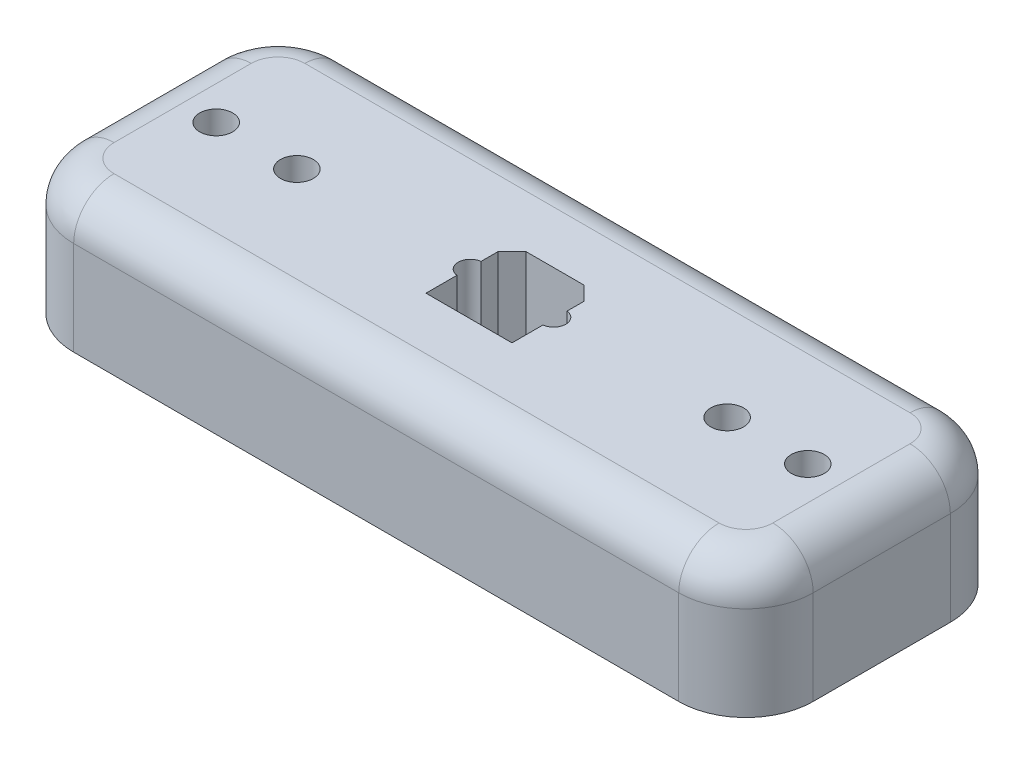
ISO-10303-21;
HEADER;
FILE_DESCRIPTION(('STEP AP214'),'2;1');
FILE_NAME('part.step','',(''),(''),'','','');
FILE_SCHEMA(('AUTOMOTIVE_DESIGN { 1 0 10303 214 1 1 1 1 }'));
ENDSEC;
DATA;
#1=APPLICATION_CONTEXT('core data for automotive mechanical design processes');
#2=APPLICATION_PROTOCOL_DEFINITION('international standard','automotive_design',2000,#1);
#3=PRODUCT_CONTEXT('',#1,'mechanical');
#4=PRODUCT('Part','Part','',(#3));
#5=PRODUCT_RELATED_PRODUCT_CATEGORY('part','',(#4));
#6=PRODUCT_DEFINITION_FORMATION('','',#4);
#7=PRODUCT_DEFINITION_CONTEXT('part definition',#1,'design');
#8=PRODUCT_DEFINITION('design','',#6,#7);
#9=PRODUCT_DEFINITION_SHAPE('','',#8);
#10=(LENGTH_UNIT() NAMED_UNIT(*) SI_UNIT(.MILLI.,.METRE.));
#11=(NAMED_UNIT(*) PLANE_ANGLE_UNIT() SI_UNIT($,.RADIAN.));
#12=(NAMED_UNIT(*) SI_UNIT($,.STERADIAN.) SOLID_ANGLE_UNIT());
#13=UNCERTAINTY_MEASURE_WITH_UNIT(LENGTH_MEASURE(1.E-05),#10,'distance_accuracy_value','');
#14=(GEOMETRIC_REPRESENTATION_CONTEXT(3) GLOBAL_UNCERTAINTY_ASSIGNED_CONTEXT((#13)) GLOBAL_UNIT_ASSIGNED_CONTEXT((#10,
#11,#12)) REPRESENTATION_CONTEXT('',''));
#15=CARTESIAN_POINT('',(0.,0.,0.));
#16=DIRECTION('',(0.,0.,1.));
#17=DIRECTION('',(1.,0.,0.));
#18=AXIS2_PLACEMENT_3D('',#15,#16,#17);
#19=CARTESIAN_POINT('',(0.,10.,-10.1));
#20=DIRECTION('',(0.,0.,1.));
#21=DIRECTION('',(1.,0.,0.));
#22=AXIS2_PLACEMENT_3D('',#19,#20,#21);
#23=PLANE('',#22);
#24=DIRECTION('',(0.,-1.,0.));
#25=VECTOR('',#24,1.);
#26=CARTESIAN_POINT('',(-22.5,10.,-10.1));
#27=LINE('',#26,#25);
#28=CARTESIAN_POINT('',(-22.5,7.,-10.1));
#29=VERTEX_POINT('',#28);
#30=CARTESIAN_POINT('',(-22.5,0.,-10.1));
#31=VERTEX_POINT('',#30);
#32=EDGE_CURVE('E226',#29,#31,#27,.T.);
#33=ORIENTED_EDGE('',*,*,#32,.F.);
#34=DIRECTION('',(-1.,0.,0.));
#35=VECTOR('',#34,1.);
#36=CARTESIAN_POINT('',(22.5,7.,-10.1));
#37=LINE('',#36,#35);
#38=CARTESIAN_POINT('',(22.5,7.,-10.1));
#39=VERTEX_POINT('',#38);
#40=EDGE_CURVE('E47',#29,#39,#37,.F.);
#41=ORIENTED_EDGE('',*,*,#40,.T.);
#42=DIRECTION('',(0.,-1.,0.));
#43=VECTOR('',#42,1.);
#44=CARTESIAN_POINT('',(22.5,10.,-10.1));
#45=LINE('',#44,#43);
#46=CARTESIAN_POINT('',(22.5,0.,-10.1));
#47=VERTEX_POINT('',#46);
#48=EDGE_CURVE('E214',#39,#47,#45,.T.);
#49=ORIENTED_EDGE('',*,*,#48,.T.);
#50=DIRECTION('',(-1.,0.,0.));
#51=VECTOR('',#50,1.);
#52=CARTESIAN_POINT('',(0.,0.,-10.1));
#53=LINE('',#52,#51);
#54=EDGE_CURVE('E338',#47,#31,#53,.T.);
#55=ORIENTED_EDGE('',*,*,#54,.T.);
#56=EDGE_LOOP('',(#33,#41,#49,#55));
#57=FACE_BOUND('',#56,.T.);
#58=ADVANCED_FACE('F38',(#57),#23,.F.);
#59=CARTESIAN_POINT('',(-22.5,10.,-5.09999999999998));
#60=DIRECTION('',(0.,-1.,0.));
#61=DIRECTION('',(0.,0.,-1.));
#62=AXIS2_PLACEMENT_3D('',#59,#60,#61);
#63=CYLINDRICAL_SURFACE('',#62,5.);
#64=DIRECTION('',(0.,-1.,0.));
#65=VECTOR('',#64,1.);
#66=CARTESIAN_POINT('',(-27.5,10.,-5.09999999999994));
#67=LINE('',#66,#65);
#68=CARTESIAN_POINT('',(-27.5,7.,-5.09999999999994));
#69=VERTEX_POINT('',#68);
#70=CARTESIAN_POINT('',(-27.5,0.,-5.09999999999994));
#71=VERTEX_POINT('',#70);
#72=EDGE_CURVE('E370',#69,#71,#67,.T.);
#73=ORIENTED_EDGE('',*,*,#72,.F.);
#74=CARTESIAN_POINT('',(-22.5,7.,-5.09999999999998));
#75=DIRECTION('',(0.,1.,0.));
#76=DIRECTION('',(0.,0.,1.));
#77=AXIS2_PLACEMENT_3D('',#74,#75,#76);
#78=CIRCLE('',#77,5.);
#79=EDGE_CURVE('E244',#69,#29,#78,.F.);
#80=ORIENTED_EDGE('',*,*,#79,.T.);
#81=ORIENTED_EDGE('',*,*,#32,.T.);
#82=CARTESIAN_POINT('',(-22.5,0.,-5.09999999999998));
#83=DIRECTION('',(0.,1.,0.));
#84=DIRECTION('',(0.,0.,1.));
#85=AXIS2_PLACEMENT_3D('',#82,#83,#84);
#86=CIRCLE('',#85,5.);
#87=EDGE_CURVE('E341',#31,#71,#86,.T.);
#88=ORIENTED_EDGE('',*,*,#87,.T.);
#89=EDGE_LOOP('',(#73,#80,#81,#88));
#90=FACE_BOUND('',#89,.T.);
#91=ADVANCED_FACE('F446',(#90),#63,.T.);
#92=CARTESIAN_POINT('',(-27.5,10.,0.));
#93=DIRECTION('',(1.,0.,0.));
#94=DIRECTION('',(0.,0.,-1.));
#95=AXIS2_PLACEMENT_3D('',#92,#93,#94);
#96=PLANE('',#95);
#97=DIRECTION('',(0.,-1.,0.));
#98=VECTOR('',#97,1.);
#99=CARTESIAN_POINT('',(-27.5,10.,5.09999999999998));
#100=LINE('',#99,#98);
#101=CARTESIAN_POINT('',(-27.5,7.,5.09999999999998));
#102=VERTEX_POINT('',#101);
#103=CARTESIAN_POINT('',(-27.5,0.,5.09999999999998));
#104=VERTEX_POINT('',#103);
#105=EDGE_CURVE('E368',#102,#104,#100,.T.);
#106=ORIENTED_EDGE('',*,*,#105,.F.);
#107=DIRECTION('',(0.,0.,1.));
#108=VECTOR('',#107,1.);
#109=CARTESIAN_POINT('',(-27.5,7.,-5.09999999999994));
#110=LINE('',#109,#108);
#111=EDGE_CURVE('E249',#102,#69,#110,.F.);
#112=ORIENTED_EDGE('',*,*,#111,.T.);
#113=ORIENTED_EDGE('',*,*,#72,.T.);
#114=DIRECTION('',(0.,0.,1.));
#115=VECTOR('',#114,1.);
#116=CARTESIAN_POINT('',(-27.5,0.,0.));
#117=LINE('',#116,#115);
#118=EDGE_CURVE('E344',#71,#104,#117,.T.);
#119=ORIENTED_EDGE('',*,*,#118,.T.);
#120=EDGE_LOOP('',(#106,#112,#113,#119));
#121=FACE_BOUND('',#120,.T.);
#122=ADVANCED_FACE('F452',(#121),#96,.F.);
#123=CARTESIAN_POINT('',(-22.5,10.,5.10000000000002));
#124=DIRECTION('',(0.,-1.,0.));
#125=DIRECTION('',(0.,0.,-1.));
#126=AXIS2_PLACEMENT_3D('',#123,#124,#125);
#127=CYLINDRICAL_SURFACE('',#126,5.);
#128=DIRECTION('',(0.,-1.,0.));
#129=VECTOR('',#128,1.);
#130=CARTESIAN_POINT('',(-22.5,10.,10.1));
#131=LINE('',#130,#129);
#132=CARTESIAN_POINT('',(-22.5,7.,10.1));
#133=VERTEX_POINT('',#132);
#134=CARTESIAN_POINT('',(-22.5,0.,10.1));
#135=VERTEX_POINT('',#134);
#136=EDGE_CURVE('E366',#133,#135,#131,.T.);
#137=ORIENTED_EDGE('',*,*,#136,.F.);
#138=CARTESIAN_POINT('',(-22.5,7.,5.10000000000002));
#139=DIRECTION('',(0.,1.,0.));
#140=DIRECTION('',(0.,0.,1.));
#141=AXIS2_PLACEMENT_3D('',#138,#139,#140);
#142=CIRCLE('',#141,5.);
#143=EDGE_CURVE('E241',#133,#102,#142,.F.);
#144=ORIENTED_EDGE('',*,*,#143,.T.);
#145=ORIENTED_EDGE('',*,*,#105,.T.);
#146=CARTESIAN_POINT('',(-22.5,0.,5.10000000000002));
#147=DIRECTION('',(0.,1.,0.));
#148=DIRECTION('',(0.,0.,1.));
#149=AXIS2_PLACEMENT_3D('',#146,#147,#148);
#150=CIRCLE('',#149,5.);
#151=EDGE_CURVE('E347',#104,#135,#150,.T.);
#152=ORIENTED_EDGE('',*,*,#151,.T.);
#153=EDGE_LOOP('',(#137,#144,#145,#152));
#154=FACE_BOUND('',#153,.T.);
#155=ADVANCED_FACE('F716',(#154),#127,.T.);
#156=CARTESIAN_POINT('',(0.,10.,10.1));
#157=DIRECTION('',(0.,0.,-1.));
#158=DIRECTION('',(-1.,0.,0.));
#159=AXIS2_PLACEMENT_3D('',#156,#157,#158);
#160=PLANE('',#159);
#161=DIRECTION('',(0.,-1.,0.));
#162=VECTOR('',#161,1.);
#163=CARTESIAN_POINT('',(22.5,10.,10.1));
#164=LINE('',#163,#162);
#165=CARTESIAN_POINT('',(22.5,7.,10.1));
#166=VERTEX_POINT('',#165);
#167=CARTESIAN_POINT('',(22.5,0.,10.1));
#168=VERTEX_POINT('',#167);
#169=EDGE_CURVE('E364',#166,#168,#164,.T.);
#170=ORIENTED_EDGE('',*,*,#169,.F.);
#171=DIRECTION('',(1.,0.,0.));
#172=VECTOR('',#171,1.);
#173=CARTESIAN_POINT('',(-22.5,7.,10.1));
#174=LINE('',#173,#172);
#175=EDGE_CURVE('E11',#166,#133,#174,.F.);
#176=ORIENTED_EDGE('',*,*,#175,.T.);
#177=ORIENTED_EDGE('',*,*,#136,.T.);
#178=DIRECTION('',(1.,0.,0.));
#179=VECTOR('',#178,1.);
#180=CARTESIAN_POINT('',(0.,0.,10.1));
#181=LINE('',#180,#179);
#182=EDGE_CURVE('E350',#135,#168,#181,.T.);
#183=ORIENTED_EDGE('',*,*,#182,.T.);
#184=EDGE_LOOP('',(#170,#176,#177,#183));
#185=FACE_BOUND('',#184,.T.);
#186=ADVANCED_FACE('F708',(#185),#160,.F.);
#187=CARTESIAN_POINT('',(22.5,10.,5.10000000000001));
#188=DIRECTION('',(0.,-1.,0.));
#189=DIRECTION('',(0.,0.,-1.));
#190=AXIS2_PLACEMENT_3D('',#187,#188,#189);
#191=CYLINDRICAL_SURFACE('',#190,5.);
#192=DIRECTION('',(0.,-1.,0.));
#193=VECTOR('',#192,1.);
#194=CARTESIAN_POINT('',(27.5,10.,5.09999999999998));
#195=LINE('',#194,#193);
#196=CARTESIAN_POINT('',(27.5,7.,5.09999999999998));
#197=VERTEX_POINT('',#196);
#198=CARTESIAN_POINT('',(27.5,0.,5.09999999999998));
#199=VERTEX_POINT('',#198);
#200=EDGE_CURVE('E362',#197,#199,#195,.T.);
#201=ORIENTED_EDGE('',*,*,#200,.F.);
#202=CARTESIAN_POINT('',(22.5,7.,5.10000000000001));
#203=DIRECTION('',(0.,1.,0.));
#204=DIRECTION('',(0.,0.,1.));
#205=AXIS2_PLACEMENT_3D('',#202,#203,#204);
#206=CIRCLE('',#205,5.);
#207=EDGE_CURVE('E55',#197,#166,#206,.F.);
#208=ORIENTED_EDGE('',*,*,#207,.T.);
#209=ORIENTED_EDGE('',*,*,#169,.T.);
#210=CARTESIAN_POINT('',(22.5,0.,5.10000000000001));
#211=DIRECTION('',(0.,1.,0.));
#212=DIRECTION('',(0.,0.,1.));
#213=AXIS2_PLACEMENT_3D('',#210,#211,#212);
#214=CIRCLE('',#213,5.);
#215=EDGE_CURVE('E353',#199,#168,#214,.F.);
#216=ORIENTED_EDGE('',*,*,#215,.F.);
#217=EDGE_LOOP('',(#201,#208,#209,#216));
#218=FACE_BOUND('',#217,.T.);
#219=ADVANCED_FACE('F700',(#218),#191,.T.);
#220=CARTESIAN_POINT('',(27.5,10.,0.));
#221=DIRECTION('',(-1.,0.,0.));
#222=DIRECTION('',(0.,0.,1.));
#223=AXIS2_PLACEMENT_3D('',#220,#221,#222);
#224=PLANE('',#223);
#225=DIRECTION('',(0.,-1.,0.));
#226=VECTOR('',#225,1.);
#227=CARTESIAN_POINT('',(27.5,10.,-5.09999999999995));
#228=LINE('',#227,#226);
#229=CARTESIAN_POINT('',(27.5,7.,-5.09999999999995));
#230=VERTEX_POINT('',#229);
#231=CARTESIAN_POINT('',(27.5,0.,-5.09999999999995));
#232=VERTEX_POINT('',#231);
#233=EDGE_CURVE('E217',#230,#232,#228,.T.);
#234=ORIENTED_EDGE('',*,*,#233,.F.);
#235=DIRECTION('',(0.,0.,-1.));
#236=VECTOR('',#235,1.);
#237=CARTESIAN_POINT('',(27.5,7.,5.09999999999998));
#238=LINE('',#237,#236);
#239=EDGE_CURVE('E63',#230,#197,#238,.F.);
#240=ORIENTED_EDGE('',*,*,#239,.T.);
#241=ORIENTED_EDGE('',*,*,#200,.T.);
#242=DIRECTION('',(0.,0.,-1.));
#243=VECTOR('',#242,1.);
#244=CARTESIAN_POINT('',(27.5,0.,0.));
#245=LINE('',#244,#243);
#246=EDGE_CURVE('E356',#199,#232,#245,.T.);
#247=ORIENTED_EDGE('',*,*,#246,.T.);
#248=EDGE_LOOP('',(#234,#240,#241,#247));
#249=FACE_BOUND('',#248,.T.);
#250=ADVANCED_FACE('F693',(#249),#224,.F.);
#251=CARTESIAN_POINT('',(-3.1,10.,0.));
#252=DIRECTION('',(0.,-1.,0.));
#253=DIRECTION('',(0.,0.,-1.));
#254=AXIS2_PLACEMENT_3D('',#251,#252,#253);
#255=CYLINDRICAL_SURFACE('',#254,0.9);
#256=CARTESIAN_POINT('',(-3.1,2.5,0.));
#257=DIRECTION('',(0.,1.,0.));
#258=DIRECTION('',(0.,0.,1.));
#259=AXIS2_PLACEMENT_3D('',#256,#257,#258);
#260=CIRCLE('',#259,0.9);
#261=CARTESIAN_POINT('',(-3.2,2.5,-0.894427190999916));
#262=VERTEX_POINT('',#261);
#263=CARTESIAN_POINT('',(-3.2,2.5,0.894427190999916));
#264=VERTEX_POINT('',#263);
#265=EDGE_CURVE('E191',#262,#264,#260,.T.);
#266=ORIENTED_EDGE('',*,*,#265,.F.);
#267=DIRECTION('',(0.,-1.,0.));
#268=VECTOR('',#267,1.);
#269=CARTESIAN_POINT('',(-3.2,10.,-0.894427190999916));
#270=LINE('',#269,#268);
#271=CARTESIAN_POINT('',(-3.2,10.,-0.894427190999916));
#272=VERTEX_POINT('',#271);
#273=EDGE_CURVE('E205',#272,#262,#270,.T.);
#274=ORIENTED_EDGE('',*,*,#273,.F.);
#275=CARTESIAN_POINT('',(-3.1,10.,0.));
#276=DIRECTION('',(0.,1.,0.));
#277=DIRECTION('',(0.,0.,1.));
#278=AXIS2_PLACEMENT_3D('',#275,#276,#277);
#279=CIRCLE('',#278,0.9);
#280=CARTESIAN_POINT('',(-3.2,10.,0.894427190999916));
#281=VERTEX_POINT('',#280);
#282=EDGE_CURVE('E301',#272,#281,#279,.T.);
#283=ORIENTED_EDGE('',*,*,#282,.T.);
#284=DIRECTION('',(0.,-1.,0.));
#285=VECTOR('',#284,1.);
#286=CARTESIAN_POINT('',(-3.2,10.,0.894427190999916));
#287=LINE('',#286,#285);
#288=EDGE_CURVE('E208',#281,#264,#287,.T.);
#289=ORIENTED_EDGE('',*,*,#288,.T.);
#290=EDGE_LOOP('',(#266,#274,#283,#289));
#291=FACE_BOUND('',#290,.T.);
#292=ADVANCED_FACE('F203',(#291),#255,.F.);
#293=CARTESIAN_POINT('',(-3.2,10.,0.));
#294=DIRECTION('',(-1.,0.,0.));
#295=DIRECTION('',(0.,0.,1.));
#296=AXIS2_PLACEMENT_3D('',#293,#294,#295);
#297=PLANE('',#296);
#298=ORIENTED_EDGE('',*,*,#273,.T.);
#299=DIRECTION('',(0.,0.,-1.));
#300=VECTOR('',#299,1.);
#301=CARTESIAN_POINT('',(-3.2,2.5,0.));
#302=LINE('',#301,#300);
#303=CARTESIAN_POINT('',(-3.2,2.5,-2.14142135623731));
#304=VERTEX_POINT('',#303);
#305=EDGE_CURVE('E188',#262,#304,#302,.T.);
#306=ORIENTED_EDGE('',*,*,#305,.T.);
#307=DIRECTION('',(0.,-1.,0.));
#308=VECTOR('',#307,1.);
#309=CARTESIAN_POINT('',(-3.2,10.,-2.14142135623731));
#310=LINE('',#309,#308);
#311=CARTESIAN_POINT('',(-3.2,10.,-2.14142135623731));
#312=VERTEX_POINT('',#311);
#313=EDGE_CURVE('E215',#312,#304,#310,.T.);
#314=ORIENTED_EDGE('',*,*,#313,.F.);
#315=DIRECTION('',(0.,0.,-1.));
#316=VECTOR('',#315,1.);
#317=CARTESIAN_POINT('',(-3.2,10.,0.));
#318=LINE('',#317,#316);
#319=EDGE_CURVE('E212',#272,#312,#318,.T.);
#320=ORIENTED_EDGE('',*,*,#319,.F.);
#321=EDGE_LOOP('',(#298,#306,#314,#320));
#322=FACE_BOUND('',#321,.T.);
#323=ADVANCED_FACE('F211',(#322),#297,.F.);
#324=CARTESIAN_POINT('',(-2.67071067811865,10.,-2.67071067811865));
#325=DIRECTION('',(0.707106781186548,0.,0.707106781186548));
#326=DIRECTION('',(0.707106781186548,0.,-0.707106781186548));
#327=AXIS2_PLACEMENT_3D('',#324,#325,#326);
#328=PLANE('',#327);
#329=DIRECTION('',(-0.707106781186548,0.,0.707106781186548));
#330=VECTOR('',#329,1.);
#331=CARTESIAN_POINT('',(-2.67071067811865,2.5,-2.67071067811865));
#332=LINE('',#331,#330);
#333=CARTESIAN_POINT('',(-2.14142135623731,2.5,-3.2));
#334=VERTEX_POINT('',#333);
#335=EDGE_CURVE('E194',#334,#304,#332,.T.);
#336=ORIENTED_EDGE('',*,*,#335,.F.);
#337=DIRECTION('',(0.,-1.,0.));
#338=VECTOR('',#337,1.);
#339=CARTESIAN_POINT('',(-2.14142135623731,10.,-3.2));
#340=LINE('',#339,#338);
#341=CARTESIAN_POINT('',(-2.14142135623731,10.,-3.2));
#342=VERTEX_POINT('',#341);
#343=EDGE_CURVE('E219',#342,#334,#340,.T.);
#344=ORIENTED_EDGE('',*,*,#343,.F.);
#345=DIRECTION('',(-0.707106781186548,0.,0.707106781186548));
#346=VECTOR('',#345,1.);
#347=CARTESIAN_POINT('',(-2.67071067811865,10.,-2.67071067811865));
#348=LINE('',#347,#346);
#349=EDGE_CURVE('E304',#342,#312,#348,.T.);
#350=ORIENTED_EDGE('',*,*,#349,.T.);
#351=ORIENTED_EDGE('',*,*,#313,.T.);
#352=EDGE_LOOP('',(#336,#344,#350,#351));
#353=FACE_BOUND('',#352,.T.);
#354=ADVANCED_FACE('F400',(#353),#328,.T.);
#355=CARTESIAN_POINT('',(0.,10.,-3.2));
#356=DIRECTION('',(0.,0.,-1.));
#357=DIRECTION('',(-1.,0.,0.));
#358=AXIS2_PLACEMENT_3D('',#355,#356,#357);
#359=PLANE('',#358);
#360=ORIENTED_EDGE('',*,*,#343,.T.);
#361=DIRECTION('',(1.,0.,0.));
#362=VECTOR('',#361,1.);
#363=CARTESIAN_POINT('',(0.,2.5,-3.2));
#364=LINE('',#363,#362);
#365=CARTESIAN_POINT('',(2.14142135623732,2.5,-3.2));
#366=VERTEX_POINT('',#365);
#367=EDGE_CURVE('E397',#334,#366,#364,.T.);
#368=ORIENTED_EDGE('',*,*,#367,.T.);
#369=DIRECTION('',(0.,-1.,0.));
#370=VECTOR('',#369,1.);
#371=CARTESIAN_POINT('',(2.14142135623732,10.,-3.2));
#372=LINE('',#371,#370);
#373=CARTESIAN_POINT('',(2.14142135623732,10.,-3.2));
#374=VERTEX_POINT('',#373);
#375=EDGE_CURVE('E389',#374,#366,#372,.T.);
#376=ORIENTED_EDGE('',*,*,#375,.F.);
#377=DIRECTION('',(1.,0.,0.));
#378=VECTOR('',#377,1.);
#379=CARTESIAN_POINT('',(0.,10.,-3.2));
#380=LINE('',#379,#378);
#381=EDGE_CURVE('E307',#342,#374,#380,.T.);
#382=ORIENTED_EDGE('',*,*,#381,.F.);
#383=EDGE_LOOP('',(#360,#368,#376,#382));
#384=FACE_BOUND('',#383,.T.);
#385=ADVANCED_FACE('F395',(#384),#359,.F.);
#386=CARTESIAN_POINT('',(2.67071067811866,10.,-2.67071067811866));
#387=DIRECTION('',(0.707106781186548,0.,-0.707106781186548));
#388=DIRECTION('',(-0.707106781186548,0.,-0.707106781186548));
#389=AXIS2_PLACEMENT_3D('',#386,#387,#388);
#390=PLANE('',#389);
#391=ORIENTED_EDGE('',*,*,#375,.T.);
#392=DIRECTION('',(0.707106781186548,0.,0.707106781186548));
#393=VECTOR('',#392,1.);
#394=CARTESIAN_POINT('',(2.67071067811866,2.5,-2.67071067811866));
#395=LINE('',#394,#393);
#396=CARTESIAN_POINT('',(3.2,2.5,-2.14142135623731));
#397=VERTEX_POINT('',#396);
#398=EDGE_CURVE('E401',#366,#397,#395,.T.);
#399=ORIENTED_EDGE('',*,*,#398,.T.);
#400=DIRECTION('',(0.,-1.,0.));
#401=VECTOR('',#400,1.);
#402=CARTESIAN_POINT('',(3.2,10.,-2.14142135623731));
#403=LINE('',#402,#401);
#404=CARTESIAN_POINT('',(3.2,10.,-2.14142135623731));
#405=VERTEX_POINT('',#404);
#406=EDGE_CURVE('E386',#405,#397,#403,.T.);
#407=ORIENTED_EDGE('',*,*,#406,.F.);
#408=DIRECTION('',(0.707106781186548,0.,0.707106781186548));
#409=VECTOR('',#408,1.);
#410=CARTESIAN_POINT('',(2.67071067811866,10.,-2.67071067811866));
#411=LINE('',#410,#409);
#412=EDGE_CURVE('E310',#374,#405,#411,.T.);
#413=ORIENTED_EDGE('',*,*,#412,.F.);
#414=EDGE_LOOP('',(#391,#399,#407,#413));
#415=FACE_BOUND('',#414,.T.);
#416=ADVANCED_FACE('F436',(#415),#390,.F.);
#417=CARTESIAN_POINT('',(3.2,10.,0.));
#418=DIRECTION('',(-1.,0.,0.));
#419=DIRECTION('',(0.,0.,1.));
#420=AXIS2_PLACEMENT_3D('',#417,#418,#419);
#421=PLANE('',#420);
#422=DIRECTION('',(0.,0.,-1.));
#423=VECTOR('',#422,1.);
#424=CARTESIAN_POINT('',(3.2,2.5,0.));
#425=LINE('',#424,#423);
#426=CARTESIAN_POINT('',(3.2,2.5,-0.894427190999917));
#427=VERTEX_POINT('',#426);
#428=EDGE_CURVE('E403',#427,#397,#425,.T.);
#429=ORIENTED_EDGE('',*,*,#428,.F.);
#430=DIRECTION('',(0.,-1.,0.));
#431=VECTOR('',#430,1.);
#432=CARTESIAN_POINT('',(3.2,10.,-0.894427190999917));
#433=LINE('',#432,#431);
#434=CARTESIAN_POINT('',(3.2,10.,-0.894427190999917));
#435=VERTEX_POINT('',#434);
#436=EDGE_CURVE('E383',#435,#427,#433,.T.);
#437=ORIENTED_EDGE('',*,*,#436,.F.);
#438=DIRECTION('',(0.,0.,-1.));
#439=VECTOR('',#438,1.);
#440=CARTESIAN_POINT('',(3.2,10.,0.));
#441=LINE('',#440,#439);
#442=EDGE_CURVE('E312',#435,#405,#441,.T.);
#443=ORIENTED_EDGE('',*,*,#442,.T.);
#444=ORIENTED_EDGE('',*,*,#406,.T.);
#445=EDGE_LOOP('',(#429,#437,#443,#444));
#446=FACE_BOUND('',#445,.T.);
#447=ADVANCED_FACE('F433',(#446),#421,.T.);
#448=CARTESIAN_POINT('',(3.1,10.,0.));
#449=DIRECTION('',(0.,-1.,0.));
#450=DIRECTION('',(0.,0.,-1.));
#451=AXIS2_PLACEMENT_3D('',#448,#449,#450);
#452=CYLINDRICAL_SURFACE('',#451,0.9);
#453=CARTESIAN_POINT('',(3.1,2.5,0.));
#454=DIRECTION('',(0.,1.,0.));
#455=DIRECTION('',(0.,0.,1.));
#456=AXIS2_PLACEMENT_3D('',#453,#454,#455);
#457=CIRCLE('',#456,0.9);
#458=CARTESIAN_POINT('',(3.2,2.5,0.894427190999915));
#459=VERTEX_POINT('',#458);
#460=EDGE_CURVE('E407',#459,#427,#457,.T.);
#461=ORIENTED_EDGE('',*,*,#460,.F.);
#462=DIRECTION('',(0.,-1.,0.));
#463=VECTOR('',#462,1.);
#464=CARTESIAN_POINT('',(3.2,10.,0.894427190999915));
#465=LINE('',#464,#463);
#466=CARTESIAN_POINT('',(3.2,10.,0.894427190999915));
#467=VERTEX_POINT('',#466);
#468=EDGE_CURVE('E380',#467,#459,#465,.T.);
#469=ORIENTED_EDGE('',*,*,#468,.F.);
#470=CARTESIAN_POINT('',(3.1,10.,0.));
#471=DIRECTION('',(0.,1.,0.));
#472=DIRECTION('',(0.,0.,1.));
#473=AXIS2_PLACEMENT_3D('',#470,#471,#472);
#474=CIRCLE('',#473,0.9);
#475=EDGE_CURVE('E315',#467,#435,#474,.T.);
#476=ORIENTED_EDGE('',*,*,#475,.T.);
#477=ORIENTED_EDGE('',*,*,#436,.T.);
#478=EDGE_LOOP('',(#461,#469,#476,#477));
#479=FACE_BOUND('',#478,.T.);
#480=ADVANCED_FACE('F430',(#479),#452,.F.);
#481=CARTESIAN_POINT('',(3.2,10.,0.));
#482=DIRECTION('',(-1.,0.,0.));
#483=DIRECTION('',(0.,0.,1.));
#484=AXIS2_PLACEMENT_3D('',#481,#482,#483);
#485=PLANE('',#484);
#486=DIRECTION('',(0.,0.,-1.));
#487=VECTOR('',#486,1.);
#488=CARTESIAN_POINT('',(3.2,2.5,0.));
#489=LINE('',#488,#487);
#490=CARTESIAN_POINT('',(3.2,2.5,3.2));
#491=VERTEX_POINT('',#490);
#492=EDGE_CURVE('E409',#491,#459,#489,.T.);
#493=ORIENTED_EDGE('',*,*,#492,.F.);
#494=DIRECTION('',(0.,-1.,0.));
#495=VECTOR('',#494,1.);
#496=CARTESIAN_POINT('',(3.2,10.,3.2));
#497=LINE('',#496,#495);
#498=CARTESIAN_POINT('',(3.2,10.,3.2));
#499=VERTEX_POINT('',#498);
#500=EDGE_CURVE('E377',#499,#491,#497,.T.);
#501=ORIENTED_EDGE('',*,*,#500,.F.);
#502=DIRECTION('',(0.,0.,-1.));
#503=VECTOR('',#502,1.);
#504=CARTESIAN_POINT('',(3.2,10.,0.));
#505=LINE('',#504,#503);
#506=EDGE_CURVE('E318',#499,#467,#505,.T.);
#507=ORIENTED_EDGE('',*,*,#506,.T.);
#508=ORIENTED_EDGE('',*,*,#468,.T.);
#509=EDGE_LOOP('',(#493,#501,#507,#508));
#510=FACE_BOUND('',#509,.T.);
#511=ADVANCED_FACE('F423',(#510),#485,.T.);
#512=CARTESIAN_POINT('',(0.,10.,3.2));
#513=DIRECTION('',(0.,0.,-1.));
#514=DIRECTION('',(-1.,0.,0.));
#515=AXIS2_PLACEMENT_3D('',#512,#513,#514);
#516=PLANE('',#515);
#517=DIRECTION('',(1.,0.,0.));
#518=VECTOR('',#517,1.);
#519=CARTESIAN_POINT('',(0.,2.5,3.2));
#520=LINE('',#519,#518);
#521=CARTESIAN_POINT('',(-3.2,2.5,3.2));
#522=VERTEX_POINT('',#521);
#523=EDGE_CURVE('E411',#522,#491,#520,.T.);
#524=ORIENTED_EDGE('',*,*,#523,.F.);
#525=DIRECTION('',(0.,-1.,0.));
#526=VECTOR('',#525,1.);
#527=CARTESIAN_POINT('',(-3.2,10.,3.2));
#528=LINE('',#527,#526);
#529=CARTESIAN_POINT('',(-3.2,10.,3.2));
#530=VERTEX_POINT('',#529);
#531=EDGE_CURVE('E374',#530,#522,#528,.T.);
#532=ORIENTED_EDGE('',*,*,#531,.F.);
#533=DIRECTION('',(1.,0.,0.));
#534=VECTOR('',#533,1.);
#535=CARTESIAN_POINT('',(0.,10.,3.2));
#536=LINE('',#535,#534);
#537=EDGE_CURVE('E321',#530,#499,#536,.T.);
#538=ORIENTED_EDGE('',*,*,#537,.T.);
#539=ORIENTED_EDGE('',*,*,#500,.T.);
#540=EDGE_LOOP('',(#524,#532,#538,#539));
#541=FACE_BOUND('',#540,.T.);
#542=ADVANCED_FACE('F419',(#541),#516,.T.);
#543=CARTESIAN_POINT('',(-3.2,10.,0.));
#544=DIRECTION('',(-1.,0.,0.));
#545=DIRECTION('',(0.,0.,1.));
#546=AXIS2_PLACEMENT_3D('',#543,#544,#545);
#547=PLANE('',#546);
#548=ORIENTED_EDGE('',*,*,#531,.T.);
#549=DIRECTION('',(0.,0.,-1.));
#550=VECTOR('',#549,1.);
#551=CARTESIAN_POINT('',(-3.2,2.5,0.));
#552=LINE('',#551,#550);
#553=EDGE_CURVE('E209',#522,#264,#552,.T.);
#554=ORIENTED_EDGE('',*,*,#553,.T.);
#555=ORIENTED_EDGE('',*,*,#288,.F.);
#556=DIRECTION('',(0.,0.,-1.));
#557=VECTOR('',#556,1.);
#558=CARTESIAN_POINT('',(-3.2,10.,0.));
#559=LINE('',#558,#557);
#560=EDGE_CURVE('E324',#530,#281,#559,.T.);
#561=ORIENTED_EDGE('',*,*,#560,.F.);
#562=EDGE_LOOP('',(#548,#554,#555,#561));
#563=FACE_BOUND('',#562,.T.);
#564=ADVANCED_FACE('F414',(#563),#547,.F.);
#565=CARTESIAN_POINT('',(16.,10.,0.));
#566=DIRECTION('',(0.,-1.,0.));
#567=DIRECTION('',(0.,0.,-1.));
#568=AXIS2_PLACEMENT_3D('',#565,#566,#567);
#569=CYLINDRICAL_SURFACE('',#568,1.225);
#570=CARTESIAN_POINT('',(16.,10.,0.));
#571=DIRECTION('',(0.,1.,0.));
#572=DIRECTION('',(0.,0.,1.));
#573=AXIS2_PLACEMENT_3D('',#570,#571,#572);
#574=CIRCLE('',#573,1.225);
#575=CARTESIAN_POINT('',(16.,10.,1.225));
#576=VERTEX_POINT('',#575);
#577=EDGE_CURVE('E298',#576,#576,#574,.T.);
#578=ORIENTED_EDGE('',*,*,#577,.T.);
#579=EDGE_LOOP('',(#578));
#580=FACE_BOUND('',#579,.T.);
#581=CARTESIAN_POINT('',(16.,0.,0.));
#582=DIRECTION('',(0.,1.,0.));
#583=DIRECTION('',(0.,0.,1.));
#584=AXIS2_PLACEMENT_3D('',#581,#582,#583);
#585=CIRCLE('',#584,1.225);
#586=CARTESIAN_POINT('',(16.,0.,1.225));
#587=VERTEX_POINT('',#586);
#588=EDGE_CURVE('E335',#587,#587,#585,.T.);
#589=ORIENTED_EDGE('',*,*,#588,.F.);
#590=EDGE_LOOP('',(#589));
#591=FACE_BOUND('',#590,.T.);
#592=ADVANCED_FACE('F460',(#580,#591),#569,.F.);
#593=CARTESIAN_POINT('',(-16.,10.,0.));
#594=DIRECTION('',(0.,-1.,0.));
#595=DIRECTION('',(0.,0.,-1.));
#596=AXIS2_PLACEMENT_3D('',#593,#594,#595);
#597=CYLINDRICAL_SURFACE('',#596,1.225);
#598=CARTESIAN_POINT('',(-16.,10.,0.));
#599=DIRECTION('',(0.,1.,0.));
#600=DIRECTION('',(0.,0.,1.));
#601=AXIS2_PLACEMENT_3D('',#598,#599,#600);
#602=CIRCLE('',#601,1.225);
#603=CARTESIAN_POINT('',(-16.,10.,1.225));
#604=VERTEX_POINT('',#603);
#605=EDGE_CURVE('E295',#604,#604,#602,.T.);
#606=ORIENTED_EDGE('',*,*,#605,.T.);
#607=EDGE_LOOP('',(#606));
#608=FACE_BOUND('',#607,.T.);
#609=CARTESIAN_POINT('',(-16.,0.,0.));
#610=DIRECTION('',(0.,1.,0.));
#611=DIRECTION('',(0.,0.,1.));
#612=AXIS2_PLACEMENT_3D('',#609,#610,#611);
#613=CIRCLE('',#612,1.225);
#614=CARTESIAN_POINT('',(-16.,0.,1.225));
#615=VERTEX_POINT('',#614);
#616=EDGE_CURVE('E332',#615,#615,#613,.T.);
#617=ORIENTED_EDGE('',*,*,#616,.F.);
#618=EDGE_LOOP('',(#617));
#619=FACE_BOUND('',#618,.T.);
#620=ADVANCED_FACE('F489',(#608,#619),#597,.F.);
#621=CARTESIAN_POINT('',(22.,10.,0.));
#622=DIRECTION('',(0.,-1.,0.));
#623=DIRECTION('',(0.,0.,-1.));
#624=AXIS2_PLACEMENT_3D('',#621,#622,#623);
#625=CYLINDRICAL_SURFACE('',#624,1.225);
#626=CARTESIAN_POINT('',(22.,10.,0.));
#627=DIRECTION('',(0.,1.,0.));
#628=DIRECTION('',(0.,0.,1.));
#629=AXIS2_PLACEMENT_3D('',#626,#627,#628);
#630=CIRCLE('',#629,1.225);
#631=CARTESIAN_POINT('',(22.,10.,1.225));
#632=VERTEX_POINT('',#631);
#633=EDGE_CURVE('E291',#632,#632,#630,.T.);
#634=ORIENTED_EDGE('',*,*,#633,.T.);
#635=EDGE_LOOP('',(#634));
#636=FACE_BOUND('',#635,.T.);
#637=CARTESIAN_POINT('',(22.,0.,0.));
#638=DIRECTION('',(0.,1.,0.));
#639=DIRECTION('',(0.,0.,1.));
#640=AXIS2_PLACEMENT_3D('',#637,#638,#639);
#641=CIRCLE('',#640,1.225);
#642=CARTESIAN_POINT('',(22.,0.,1.225));
#643=VERTEX_POINT('',#642);
#644=EDGE_CURVE('E329',#643,#643,#641,.T.);
#645=ORIENTED_EDGE('',*,*,#644,.F.);
#646=EDGE_LOOP('',(#645));
#647=FACE_BOUND('',#646,.T.);
#648=ADVANCED_FACE('F497',(#636,#647),#625,.F.);
#649=CARTESIAN_POINT('',(-22.,10.,0.));
#650=DIRECTION('',(0.,-1.,0.));
#651=DIRECTION('',(0.,0.,-1.));
#652=AXIS2_PLACEMENT_3D('',#649,#650,#651);
#653=CYLINDRICAL_SURFACE('',#652,1.225);
#654=CARTESIAN_POINT('',(-22.,10.,0.));
#655=DIRECTION('',(0.,1.,0.));
#656=DIRECTION('',(0.,0.,1.));
#657=AXIS2_PLACEMENT_3D('',#654,#655,#656);
#658=CIRCLE('',#657,1.225);
#659=CARTESIAN_POINT('',(-22.,10.,1.225));
#660=VERTEX_POINT('',#659);
#661=EDGE_CURVE('E288',#660,#660,#658,.T.);
#662=ORIENTED_EDGE('',*,*,#661,.T.);
#663=EDGE_LOOP('',(#662));
#664=FACE_BOUND('',#663,.T.);
#665=CARTESIAN_POINT('',(-22.,0.,0.));
#666=DIRECTION('',(0.,1.,0.));
#667=DIRECTION('',(0.,0.,1.));
#668=AXIS2_PLACEMENT_3D('',#665,#666,#667);
#669=CIRCLE('',#668,1.225);
#670=CARTESIAN_POINT('',(-22.,0.,1.225));
#671=VERTEX_POINT('',#670);
#672=EDGE_CURVE('E326',#671,#671,#669,.T.);
#673=ORIENTED_EDGE('',*,*,#672,.F.);
#674=EDGE_LOOP('',(#673));
#675=FACE_BOUND('',#674,.T.);
#676=ADVANCED_FACE('F505',(#664,#675),#653,.F.);
#677=CARTESIAN_POINT('',(22.5,10.,-5.09999999999998));
#678=DIRECTION('',(0.,-1.,0.));
#679=DIRECTION('',(0.,0.,-1.));
#680=AXIS2_PLACEMENT_3D('',#677,#678,#679);
#681=CYLINDRICAL_SURFACE('',#680,5.);
#682=ORIENTED_EDGE('',*,*,#48,.F.);
#683=CARTESIAN_POINT('',(22.5,7.,-5.09999999999998));
#684=DIRECTION('',(0.,1.,0.));
#685=DIRECTION('',(0.,0.,1.));
#686=AXIS2_PLACEMENT_3D('',#683,#684,#685);
#687=CIRCLE('',#686,5.);
#688=EDGE_CURVE('E246',#39,#230,#687,.F.);
#689=ORIENTED_EDGE('',*,*,#688,.T.);
#690=ORIENTED_EDGE('',*,*,#233,.T.);
#691=CARTESIAN_POINT('',(22.5,0.,-5.09999999999998));
#692=DIRECTION('',(0.,1.,0.));
#693=DIRECTION('',(0.,0.,1.));
#694=AXIS2_PLACEMENT_3D('',#691,#692,#693);
#695=CIRCLE('',#694,5.);
#696=EDGE_CURVE('E292',#47,#232,#695,.F.);
#697=ORIENTED_EDGE('',*,*,#696,.F.);
#698=EDGE_LOOP('',(#682,#689,#690,#697));
#699=FACE_BOUND('',#698,.T.);
#700=ADVANCED_FACE('F513',(#699),#681,.T.);
#701=CARTESIAN_POINT('',(0.,10.,0.));
#702=DIRECTION('',(0.,1.,0.));
#703=DIRECTION('',(0.,0.,1.));
#704=AXIS2_PLACEMENT_3D('',#701,#702,#703);
#705=PLANE('',#704);
#706=CARTESIAN_POINT('',(22.5,10.,-5.09999999999998));
#707=DIRECTION('',(0.,1.,0.));
#708=DIRECTION('',(0.,0.,1.));
#709=AXIS2_PLACEMENT_3D('',#706,#707,#708);
#710=CIRCLE('',#709,2.);
#711=CARTESIAN_POINT('',(24.5,10.,-5.09999999999997));
#712=VERTEX_POINT('',#711);
#713=CARTESIAN_POINT('',(22.5,10.,-7.09999999999998));
#714=VERTEX_POINT('',#713);
#715=EDGE_CURVE('E235',#712,#714,#710,.T.);
#716=ORIENTED_EDGE('',*,*,#715,.T.);
#717=DIRECTION('',(-1.,0.,0.));
#718=VECTOR('',#717,1.);
#719=CARTESIAN_POINT('',(-22.5,10.,-7.09999999999998));
#720=LINE('',#719,#718);
#721=CARTESIAN_POINT('',(-22.5,10.,-7.09999999999998));
#722=VERTEX_POINT('',#721);
#723=EDGE_CURVE('E239',#714,#722,#720,.T.);
#724=ORIENTED_EDGE('',*,*,#723,.T.);
#725=CARTESIAN_POINT('',(-22.5,10.,-5.09999999999998));
#726=DIRECTION('',(0.,1.,0.));
#727=DIRECTION('',(0.,0.,1.));
#728=AXIS2_PLACEMENT_3D('',#725,#726,#727);
#729=CIRCLE('',#728,2.);
#730=CARTESIAN_POINT('',(-24.5,10.,-5.09999999999996));
#731=VERTEX_POINT('',#730);
#732=EDGE_CURVE('E237',#722,#731,#729,.T.);
#733=ORIENTED_EDGE('',*,*,#732,.T.);
#734=DIRECTION('',(0.,0.,1.));
#735=VECTOR('',#734,1.);
#736=CARTESIAN_POINT('',(-24.5,10.,5.09999999999998));
#737=LINE('',#736,#735);
#738=CARTESIAN_POINT('',(-24.5,10.,5.1));
#739=VERTEX_POINT('',#738);
#740=EDGE_CURVE('E233',#731,#739,#737,.T.);
#741=ORIENTED_EDGE('',*,*,#740,.T.);
#742=CARTESIAN_POINT('',(-22.5,10.,5.10000000000002));
#743=DIRECTION('',(0.,1.,0.));
#744=DIRECTION('',(0.,0.,1.));
#745=AXIS2_PLACEMENT_3D('',#742,#743,#744);
#746=CIRCLE('',#745,2.);
#747=CARTESIAN_POINT('',(-22.5,10.,7.10000000000002));
#748=VERTEX_POINT('',#747);
#749=EDGE_CURVE('E228',#739,#748,#746,.T.);
#750=ORIENTED_EDGE('',*,*,#749,.T.);
#751=DIRECTION('',(1.,0.,0.));
#752=VECTOR('',#751,1.);
#753=CARTESIAN_POINT('',(22.5,10.,7.10000000000001));
#754=LINE('',#753,#752);
#755=CARTESIAN_POINT('',(22.5,10.,7.10000000000001));
#756=VERTEX_POINT('',#755);
#757=EDGE_CURVE('E223',#748,#756,#754,.T.);
#758=ORIENTED_EDGE('',*,*,#757,.T.);
#759=CARTESIAN_POINT('',(22.5,10.,5.10000000000001));
#760=DIRECTION('',(0.,1.,0.));
#761=DIRECTION('',(0.,0.,1.));
#762=AXIS2_PLACEMENT_3D('',#759,#760,#761);
#763=CIRCLE('',#762,2.);
#764=CARTESIAN_POINT('',(24.5,10.,5.1));
#765=VERTEX_POINT('',#764);
#766=EDGE_CURVE('E225',#756,#765,#763,.T.);
#767=ORIENTED_EDGE('',*,*,#766,.T.);
#768=DIRECTION('',(0.,0.,-1.));
#769=VECTOR('',#768,1.);
#770=CARTESIAN_POINT('',(24.5,10.,-5.09999999999995));
#771=LINE('',#770,#769);
#772=EDGE_CURVE('E231',#765,#712,#771,.T.);
#773=ORIENTED_EDGE('',*,*,#772,.T.);
#774=EDGE_LOOP('',(#716,#724,#733,#741,#750,#758,#767,#773));
#775=FACE_BOUND('',#774,.T.);
#776=ORIENTED_EDGE('',*,*,#661,.F.);
#777=EDGE_LOOP('',(#776));
#778=FACE_BOUND('',#777,.T.);
#779=ORIENTED_EDGE('',*,*,#633,.F.);
#780=EDGE_LOOP('',(#779));
#781=FACE_BOUND('',#780,.T.);
#782=ORIENTED_EDGE('',*,*,#605,.F.);
#783=EDGE_LOOP('',(#782));
#784=FACE_BOUND('',#783,.T.);
#785=ORIENTED_EDGE('',*,*,#577,.F.);
#786=EDGE_LOOP('',(#785));
#787=FACE_BOUND('',#786,.T.);
#788=ORIENTED_EDGE('',*,*,#282,.F.);
#789=ORIENTED_EDGE('',*,*,#319,.T.);
#790=ORIENTED_EDGE('',*,*,#349,.F.);
#791=ORIENTED_EDGE('',*,*,#381,.T.);
#792=ORIENTED_EDGE('',*,*,#412,.T.);
#793=ORIENTED_EDGE('',*,*,#442,.F.);
#794=ORIENTED_EDGE('',*,*,#475,.F.);
#795=ORIENTED_EDGE('',*,*,#506,.F.);
#796=ORIENTED_EDGE('',*,*,#537,.F.);
#797=ORIENTED_EDGE('',*,*,#560,.T.);
#798=EDGE_LOOP('',(#788,#789,#790,#791,#792,#793,#794,#795,#796,#797));
#799=FACE_BOUND('',#798,.T.);
#800=ADVANCED_FACE('F426',(#775,#778,#781,#784,#787,#799),#705,.T.);
#801=CARTESIAN_POINT('',(0.,0.,0.));
#802=DIRECTION('',(0.,1.,0.));
#803=DIRECTION('',(0.,0.,1.));
#804=AXIS2_PLACEMENT_3D('',#801,#802,#803);
#805=PLANE('',#804);
#806=ORIENTED_EDGE('',*,*,#672,.T.);
#807=EDGE_LOOP('',(#806));
#808=FACE_BOUND('',#807,.T.);
#809=ORIENTED_EDGE('',*,*,#644,.T.);
#810=EDGE_LOOP('',(#809));
#811=FACE_BOUND('',#810,.T.);
#812=ORIENTED_EDGE('',*,*,#616,.T.);
#813=EDGE_LOOP('',(#812));
#814=FACE_BOUND('',#813,.T.);
#815=ORIENTED_EDGE('',*,*,#588,.T.);
#816=EDGE_LOOP('',(#815));
#817=FACE_BOUND('',#816,.T.);
#818=ORIENTED_EDGE('',*,*,#54,.F.);
#819=ORIENTED_EDGE('',*,*,#696,.T.);
#820=ORIENTED_EDGE('',*,*,#246,.F.);
#821=ORIENTED_EDGE('',*,*,#215,.T.);
#822=ORIENTED_EDGE('',*,*,#182,.F.);
#823=ORIENTED_EDGE('',*,*,#151,.F.);
#824=ORIENTED_EDGE('',*,*,#118,.F.);
#825=ORIENTED_EDGE('',*,*,#87,.F.);
#826=EDGE_LOOP('',(#818,#819,#820,#821,#822,#823,#824,#825));
#827=FACE_BOUND('',#826,.T.);
#828=CARTESIAN_POINT('',(0.,0.,0.));
#829=DIRECTION('',(0.,1.,0.));
#830=DIRECTION('',(0.,0.,1.));
#831=AXIS2_PLACEMENT_3D('',#828,#829,#830);
#832=CIRCLE('',#831,1.25);
#833=CARTESIAN_POINT('',(0.,0.,1.25));
#834=VERTEX_POINT('',#833);
#835=EDGE_CURVE('E274',#834,#834,#832,.T.);
#836=ORIENTED_EDGE('',*,*,#835,.T.);
#837=EDGE_LOOP('',(#836));
#838=FACE_BOUND('',#837,.T.);
#839=ADVANCED_FACE('F530',(#808,#811,#814,#817,#827,#838),#805,.F.);
#840=CARTESIAN_POINT('',(0.,2.5,0.));
#841=DIRECTION('',(0.,-1.,0.));
#842=DIRECTION('',(0.,0.,-1.));
#843=AXIS2_PLACEMENT_3D('',#840,#841,#842);
#844=CYLINDRICAL_SURFACE('',#843,1.25);
#845=CARTESIAN_POINT('',(0.,2.5,0.));
#846=DIRECTION('',(0.,1.,0.));
#847=DIRECTION('',(0.,0.,1.));
#848=AXIS2_PLACEMENT_3D('',#845,#846,#847);
#849=CIRCLE('',#848,1.25);
#850=CARTESIAN_POINT('',(0.,2.5,1.25));
#851=VERTEX_POINT('',#850);
#852=EDGE_CURVE('E199',#851,#851,#849,.T.);
#853=ORIENTED_EDGE('',*,*,#852,.T.);
#854=EDGE_LOOP('',(#853));
#855=FACE_BOUND('',#854,.T.);
#856=ORIENTED_EDGE('',*,*,#835,.F.);
#857=EDGE_LOOP('',(#856));
#858=FACE_BOUND('',#857,.T.);
#859=ADVANCED_FACE('F538',(#855,#858),#844,.F.);
#860=CARTESIAN_POINT('',(0.,2.5,0.));
#861=DIRECTION('',(0.,1.,0.));
#862=DIRECTION('',(0.,0.,1.));
#863=AXIS2_PLACEMENT_3D('',#860,#861,#862);
#864=PLANE('',#863);
#865=ORIENTED_EDGE('',*,*,#852,.F.);
#866=EDGE_LOOP('',(#865));
#867=FACE_BOUND('',#866,.T.);
#868=ORIENTED_EDGE('',*,*,#305,.F.);
#869=ORIENTED_EDGE('',*,*,#265,.T.);
#870=ORIENTED_EDGE('',*,*,#553,.F.);
#871=ORIENTED_EDGE('',*,*,#523,.T.);
#872=ORIENTED_EDGE('',*,*,#492,.T.);
#873=ORIENTED_EDGE('',*,*,#460,.T.);
#874=ORIENTED_EDGE('',*,*,#428,.T.);
#875=ORIENTED_EDGE('',*,*,#398,.F.);
#876=ORIENTED_EDGE('',*,*,#367,.F.);
#877=ORIENTED_EDGE('',*,*,#335,.T.);
#878=EDGE_LOOP('',(#868,#869,#870,#871,#872,#873,#874,#875,#876,#877));
#879=FACE_BOUND('',#878,.T.);
#880=ADVANCED_FACE('F190',(#867,#879),#864,.T.);
#881=CARTESIAN_POINT('',(22.5,7.,-5.09999999999998));
#882=DIRECTION('',(0.,1.,0.));
#883=DIRECTION('',(0.,0.,1.));
#884=AXIS2_PLACEMENT_3D('',#881,#882,#883);
#885=DEGENERATE_TOROIDAL_SURFACE('',#884,2.,3.,.T.);
#886=CARTESIAN_POINT('',(24.5,7.,-5.09999999999997));
#887=DIRECTION('',(0.,0.,1.));
#888=DIRECTION('',(1.,0.,0.));
#889=AXIS2_PLACEMENT_3D('',#886,#887,#888);
#890=CIRCLE('',#889,3.);
#891=EDGE_CURVE('E268',#230,#712,#890,.T.);
#892=ORIENTED_EDGE('',*,*,#891,.F.);
#893=ORIENTED_EDGE('',*,*,#688,.F.);
#894=CARTESIAN_POINT('',(22.5,7.,-7.09999999999998));
#895=DIRECTION('',(-1.,0.,0.));
#896=DIRECTION('',(0.,0.,1.));
#897=AXIS2_PLACEMENT_3D('',#894,#895,#896);
#898=CIRCLE('',#897,3.);
#899=EDGE_CURVE('E42',#714,#39,#898,.T.);
#900=ORIENTED_EDGE('',*,*,#899,.F.);
#901=ORIENTED_EDGE('',*,*,#715,.F.);
#902=EDGE_LOOP('',(#892,#893,#900,#901));
#903=FACE_BOUND('',#902,.T.);
#904=ADVANCED_FACE('F40',(#903),#885,.T.);
#905=CARTESIAN_POINT('',(0.,7.,-7.09999999999998));
#906=DIRECTION('',(1.,0.,0.));
#907=DIRECTION('',(0.,0.,-1.));
#908=AXIS2_PLACEMENT_3D('',#905,#906,#907);
#909=CYLINDRICAL_SURFACE('',#908,3.);
#910=ORIENTED_EDGE('',*,*,#899,.T.);
#911=ORIENTED_EDGE('',*,*,#40,.F.);
#912=CARTESIAN_POINT('',(-22.5,7.,-7.09999999999998));
#913=DIRECTION('',(-1.,0.,0.));
#914=DIRECTION('',(0.,0.,1.));
#915=AXIS2_PLACEMENT_3D('',#912,#913,#914);
#916=CIRCLE('',#915,3.);
#917=EDGE_CURVE('E266',#722,#29,#916,.T.);
#918=ORIENTED_EDGE('',*,*,#917,.F.);
#919=ORIENTED_EDGE('',*,*,#723,.F.);
#920=EDGE_LOOP('',(#910,#911,#918,#919));
#921=FACE_BOUND('',#920,.T.);
#922=ADVANCED_FACE('F561',(#921),#909,.T.);
#923=CARTESIAN_POINT('',(24.5,7.,0.));
#924=DIRECTION('',(0.,0.,1.));
#925=DIRECTION('',(1.,0.,0.));
#926=AXIS2_PLACEMENT_3D('',#923,#924,#925);
#927=CYLINDRICAL_SURFACE('',#926,3.);
#928=ORIENTED_EDGE('',*,*,#891,.T.);
#929=ORIENTED_EDGE('',*,*,#772,.F.);
#930=CARTESIAN_POINT('',(24.5,7.,5.09999999999998));
#931=DIRECTION('',(0.,0.,1.));
#932=DIRECTION('',(0.,-1.,0.));
#933=AXIS2_PLACEMENT_3D('',#930,#931,#932);
#934=CIRCLE('',#933,3.);
#935=EDGE_CURVE('E263',#197,#765,#934,.T.);
#936=ORIENTED_EDGE('',*,*,#935,.F.);
#937=ORIENTED_EDGE('',*,*,#239,.F.);
#938=EDGE_LOOP('',(#928,#929,#936,#937));
#939=FACE_BOUND('',#938,.T.);
#940=ADVANCED_FACE('F568',(#939),#927,.T.);
#941=CARTESIAN_POINT('',(-22.5,7.,-5.09999999999998));
#942=DIRECTION('',(0.,1.,0.));
#943=DIRECTION('',(0.,0.,1.));
#944=AXIS2_PLACEMENT_3D('',#941,#942,#943);
#945=DEGENERATE_TOROIDAL_SURFACE('',#944,2.,3.,.T.);
#946=ORIENTED_EDGE('',*,*,#917,.T.);
#947=ORIENTED_EDGE('',*,*,#79,.F.);
#948=CARTESIAN_POINT('',(-24.5,7.,-5.09999999999996));
#949=DIRECTION('',(0.,0.,1.));
#950=DIRECTION('',(1.,0.,0.));
#951=AXIS2_PLACEMENT_3D('',#948,#949,#950);
#952=CIRCLE('',#951,3.);
#953=EDGE_CURVE('E260',#731,#69,#952,.T.);
#954=ORIENTED_EDGE('',*,*,#953,.F.);
#955=ORIENTED_EDGE('',*,*,#732,.F.);
#956=EDGE_LOOP('',(#946,#947,#954,#955));
#957=FACE_BOUND('',#956,.T.);
#958=ADVANCED_FACE('F574',(#957),#945,.T.);
#959=CARTESIAN_POINT('',(22.5,7.,5.10000000000001));
#960=DIRECTION('',(0.,1.,0.));
#961=DIRECTION('',(0.,0.,1.));
#962=AXIS2_PLACEMENT_3D('',#959,#960,#961);
#963=DEGENERATE_TOROIDAL_SURFACE('',#962,2.,3.,.T.);
#964=ORIENTED_EDGE('',*,*,#935,.T.);
#965=ORIENTED_EDGE('',*,*,#766,.F.);
#966=CARTESIAN_POINT('',(22.5,7.,7.10000000000001));
#967=DIRECTION('',(-1.,0.,0.));
#968=DIRECTION('',(0.,0.,1.));
#969=AXIS2_PLACEMENT_3D('',#966,#967,#968);
#970=CIRCLE('',#969,3.);
#971=EDGE_CURVE('E257',#166,#756,#970,.T.);
#972=ORIENTED_EDGE('',*,*,#971,.F.);
#973=ORIENTED_EDGE('',*,*,#207,.F.);
#974=EDGE_LOOP('',(#964,#965,#972,#973));
#975=FACE_BOUND('',#974,.T.);
#976=ADVANCED_FACE('F581',(#975),#963,.T.);
#977=CARTESIAN_POINT('',(-24.5,7.,0.));
#978=DIRECTION('',(0.,0.,-1.));
#979=DIRECTION('',(-1.,0.,0.));
#980=AXIS2_PLACEMENT_3D('',#977,#978,#979);
#981=CYLINDRICAL_SURFACE('',#980,3.);
#982=ORIENTED_EDGE('',*,*,#953,.T.);
#983=ORIENTED_EDGE('',*,*,#111,.F.);
#984=CARTESIAN_POINT('',(-24.5,7.,5.1));
#985=DIRECTION('',(0.,0.,1.));
#986=DIRECTION('',(1.,0.,0.));
#987=AXIS2_PLACEMENT_3D('',#984,#985,#986);
#988=CIRCLE('',#987,3.);
#989=EDGE_CURVE('E255',#739,#102,#988,.T.);
#990=ORIENTED_EDGE('',*,*,#989,.F.);
#991=ORIENTED_EDGE('',*,*,#740,.F.);
#992=EDGE_LOOP('',(#982,#983,#990,#991));
#993=FACE_BOUND('',#992,.T.);
#994=ADVANCED_FACE('F589',(#993),#981,.T.);
#995=CARTESIAN_POINT('',(0.,7.,7.10000000000001));
#996=DIRECTION('',(-1.,0.,0.));
#997=DIRECTION('',(0.,0.,1.));
#998=AXIS2_PLACEMENT_3D('',#995,#996,#997);
#999=CYLINDRICAL_SURFACE('',#998,3.);
#1000=ORIENTED_EDGE('',*,*,#971,.T.);
#1001=ORIENTED_EDGE('',*,*,#757,.F.);
#1002=CARTESIAN_POINT('',(-22.5,7.,7.10000000000002));
#1003=DIRECTION('',(-1.,0.,0.));
#1004=DIRECTION('',(0.,-1.,0.));
#1005=AXIS2_PLACEMENT_3D('',#1002,#1003,#1004);
#1006=CIRCLE('',#1005,3.);
#1007=EDGE_CURVE('E253',#133,#748,#1006,.T.);
#1008=ORIENTED_EDGE('',*,*,#1007,.F.);
#1009=ORIENTED_EDGE('',*,*,#175,.F.);
#1010=EDGE_LOOP('',(#1000,#1001,#1008,#1009));
#1011=FACE_BOUND('',#1010,.T.);
#1012=ADVANCED_FACE('F597',(#1011),#999,.T.);
#1013=CARTESIAN_POINT('',(-22.5,7.,5.10000000000002));
#1014=DIRECTION('',(0.,1.,0.));
#1015=DIRECTION('',(0.,0.,1.));
#1016=AXIS2_PLACEMENT_3D('',#1013,#1014,#1015);
#1017=DEGENERATE_TOROIDAL_SURFACE('',#1016,2.,3.,.T.);
#1018=ORIENTED_EDGE('',*,*,#989,.T.);
#1019=ORIENTED_EDGE('',*,*,#143,.F.);
#1020=ORIENTED_EDGE('',*,*,#1007,.T.);
#1021=ORIENTED_EDGE('',*,*,#749,.F.);
#1022=EDGE_LOOP('',(#1018,#1019,#1020,#1021));
#1023=FACE_BOUND('',#1022,.T.);
#1024=ADVANCED_FACE('F605',(#1023),#1017,.T.);
#1025=CLOSED_SHELL('',(#58,#91,#122,#155,#186,#219,#250,#292,#323,#354,#385,#416,#447,#480,#511,
#542,#564,#592,#620,#648,#676,#700,#800,#839,#859,#880,#904,#922,#940,#958,#976,#994,#1012,#1024));
#1026=MANIFOLD_SOLID_BREP('B2',#1025);
#1027=ADVANCED_BREP_SHAPE_REPRESENTATION('',(#18,#1026),#14);
#1028=SHAPE_DEFINITION_REPRESENTATION(#9,#1027);
ENDSEC;
END-ISO-10303-21;
